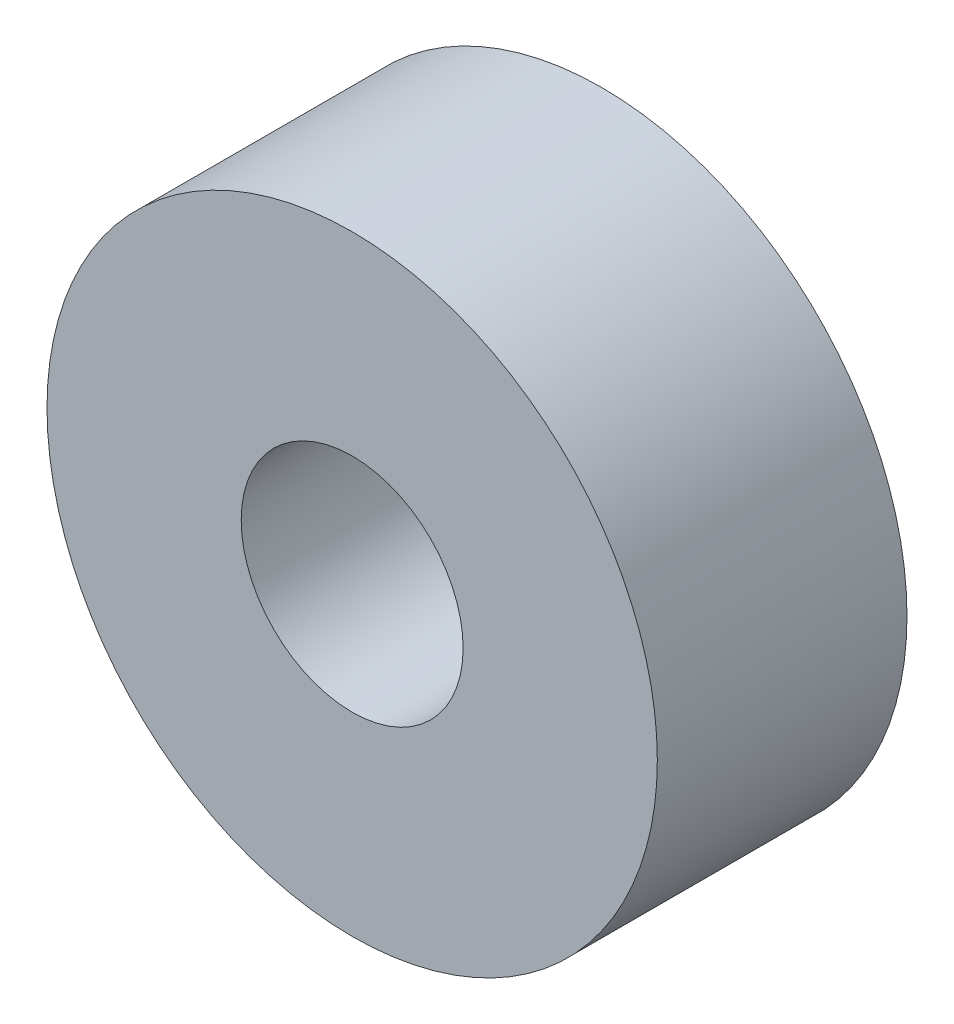
ISO-10303-21;
HEADER;
FILE_DESCRIPTION(('STEP AP214'),'2;1');
FILE_NAME('part.step','',(''),(''),'','','');
FILE_SCHEMA(('AUTOMOTIVE_DESIGN { 1 0 10303 214 1 1 1 1 }'));
ENDSEC;
DATA;
#1=APPLICATION_CONTEXT('core data for automotive mechanical design processes');
#2=APPLICATION_PROTOCOL_DEFINITION('international standard','automotive_design',2000,#1);
#3=PRODUCT_CONTEXT('',#1,'mechanical');
#4=PRODUCT('Part','Part','',(#3));
#5=PRODUCT_RELATED_PRODUCT_CATEGORY('part','',(#4));
#6=PRODUCT_DEFINITION_FORMATION('','',#4);
#7=PRODUCT_DEFINITION_CONTEXT('part definition',#1,'design');
#8=PRODUCT_DEFINITION('design','',#6,#7);
#9=PRODUCT_DEFINITION_SHAPE('','',#8);
#10=(LENGTH_UNIT() NAMED_UNIT(*) SI_UNIT(.MILLI.,.METRE.));
#11=(NAMED_UNIT(*) PLANE_ANGLE_UNIT() SI_UNIT($,.RADIAN.));
#12=(NAMED_UNIT(*) SI_UNIT($,.STERADIAN.) SOLID_ANGLE_UNIT());
#13=UNCERTAINTY_MEASURE_WITH_UNIT(LENGTH_MEASURE(1.E-05),#10,'distance_accuracy_value','');
#14=(GEOMETRIC_REPRESENTATION_CONTEXT(3) GLOBAL_UNCERTAINTY_ASSIGNED_CONTEXT((#13)) GLOBAL_UNIT_ASSIGNED_CONTEXT((#10,
#11,#12)) REPRESENTATION_CONTEXT('',''));
#15=CARTESIAN_POINT('',(0.,0.,0.));
#16=DIRECTION('',(0.,0.,1.));
#17=DIRECTION('',(1.,0.,0.));
#18=AXIS2_PLACEMENT_3D('',#15,#16,#17);
#19=CARTESIAN_POINT('',(0.,0.,18.));
#20=DIRECTION('',(0.,0.,1.));
#21=DIRECTION('',(1.,0.,0.));
#22=AXIS2_PLACEMENT_3D('',#19,#20,#21);
#23=PLANE('',#22);
#24=CARTESIAN_POINT('',(0.,0.,18.));
#25=DIRECTION('',(0.,0.,1.));
#26=DIRECTION('',(1.,0.,0.));
#27=AXIS2_PLACEMENT_3D('',#24,#25,#26);
#28=CIRCLE('',#27,22.);
#29=CARTESIAN_POINT('',(22.,0.,18.));
#30=VERTEX_POINT('',#29);
#31=EDGE_CURVE('E10',#30,#30,#28,.T.);
#32=ORIENTED_EDGE('',*,*,#31,.T.);
#33=EDGE_LOOP('',(#32));
#34=FACE_BOUND('',#33,.T.);
#35=CARTESIAN_POINT('',(0.,0.,18.));
#36=DIRECTION('',(0.,0.,1.));
#37=DIRECTION('',(1.,0.,0.));
#38=AXIS2_PLACEMENT_3D('',#35,#36,#37);
#39=CIRCLE('',#38,8.);
#40=CARTESIAN_POINT('',(8.,0.,18.));
#41=VERTEX_POINT('',#40);
#42=EDGE_CURVE('E50',#41,#41,#39,.T.);
#43=ORIENTED_EDGE('',*,*,#42,.F.);
#44=EDGE_LOOP('',(#43));
#45=FACE_BOUND('',#44,.T.);
#46=ADVANCED_FACE('F39',(#34,#45),#23,.T.);
#47=CARTESIAN_POINT('',(0.,0.,0.));
#48=DIRECTION('',(0.,0.,1.));
#49=DIRECTION('',(1.,0.,0.));
#50=AXIS2_PLACEMENT_3D('',#47,#48,#49);
#51=PLANE('',#50);
#52=CARTESIAN_POINT('',(0.,0.,0.));
#53=DIRECTION('',(0.,0.,1.));
#54=DIRECTION('',(1.,0.,0.));
#55=AXIS2_PLACEMENT_3D('',#52,#53,#54);
#56=CIRCLE('',#55,22.);
#57=CARTESIAN_POINT('',(22.,0.,0.));
#58=VERTEX_POINT('',#57);
#59=EDGE_CURVE('E43',#58,#58,#56,.T.);
#60=ORIENTED_EDGE('',*,*,#59,.F.);
#61=EDGE_LOOP('',(#60));
#62=FACE_BOUND('',#61,.T.);
#63=CARTESIAN_POINT('',(0.,0.,0.));
#64=DIRECTION('',(0.,0.,1.));
#65=DIRECTION('',(1.,0.,0.));
#66=AXIS2_PLACEMENT_3D('',#63,#64,#65);
#67=CIRCLE('',#66,8.);
#68=CARTESIAN_POINT('',(8.,0.,0.));
#69=VERTEX_POINT('',#68);
#70=EDGE_CURVE('E52',#69,#69,#67,.T.);
#71=ORIENTED_EDGE('',*,*,#70,.T.);
#72=EDGE_LOOP('',(#71));
#73=FACE_BOUND('',#72,.T.);
#74=ADVANCED_FACE('F62',(#62,#73),#51,.F.);
#75=CARTESIAN_POINT('',(0.,0.,18.));
#76=DIRECTION('',(0.,0.,-1.));
#77=DIRECTION('',(-1.,0.,0.));
#78=AXIS2_PLACEMENT_3D('',#75,#76,#77);
#79=CYLINDRICAL_SURFACE('',#78,22.);
#80=ORIENTED_EDGE('',*,*,#31,.F.);
#81=EDGE_LOOP('',(#80));
#82=FACE_BOUND('',#81,.T.);
#83=ORIENTED_EDGE('',*,*,#59,.T.);
#84=EDGE_LOOP('',(#83));
#85=FACE_BOUND('',#84,.T.);
#86=ADVANCED_FACE('F41',(#82,#85),#79,.T.);
#87=CARTESIAN_POINT('',(0.,0.,18.));
#88=DIRECTION('',(0.,0.,-1.));
#89=DIRECTION('',(-1.,0.,0.));
#90=AXIS2_PLACEMENT_3D('',#87,#88,#89);
#91=CYLINDRICAL_SURFACE('',#90,8.);
#92=ORIENTED_EDGE('',*,*,#42,.T.);
#93=EDGE_LOOP('',(#92));
#94=FACE_BOUND('',#93,.T.);
#95=ORIENTED_EDGE('',*,*,#70,.F.);
#96=EDGE_LOOP('',(#95));
#97=FACE_BOUND('',#96,.T.);
#98=ADVANCED_FACE('F58',(#94,#97),#91,.F.);
#99=CLOSED_SHELL('',(#46,#74,#86,#98));
#100=MANIFOLD_SOLID_BREP('B2',#99);
#101=ADVANCED_BREP_SHAPE_REPRESENTATION('',(#18,#100),#14);
#102=SHAPE_DEFINITION_REPRESENTATION(#9,#101);
ENDSEC;
END-ISO-10303-21;
